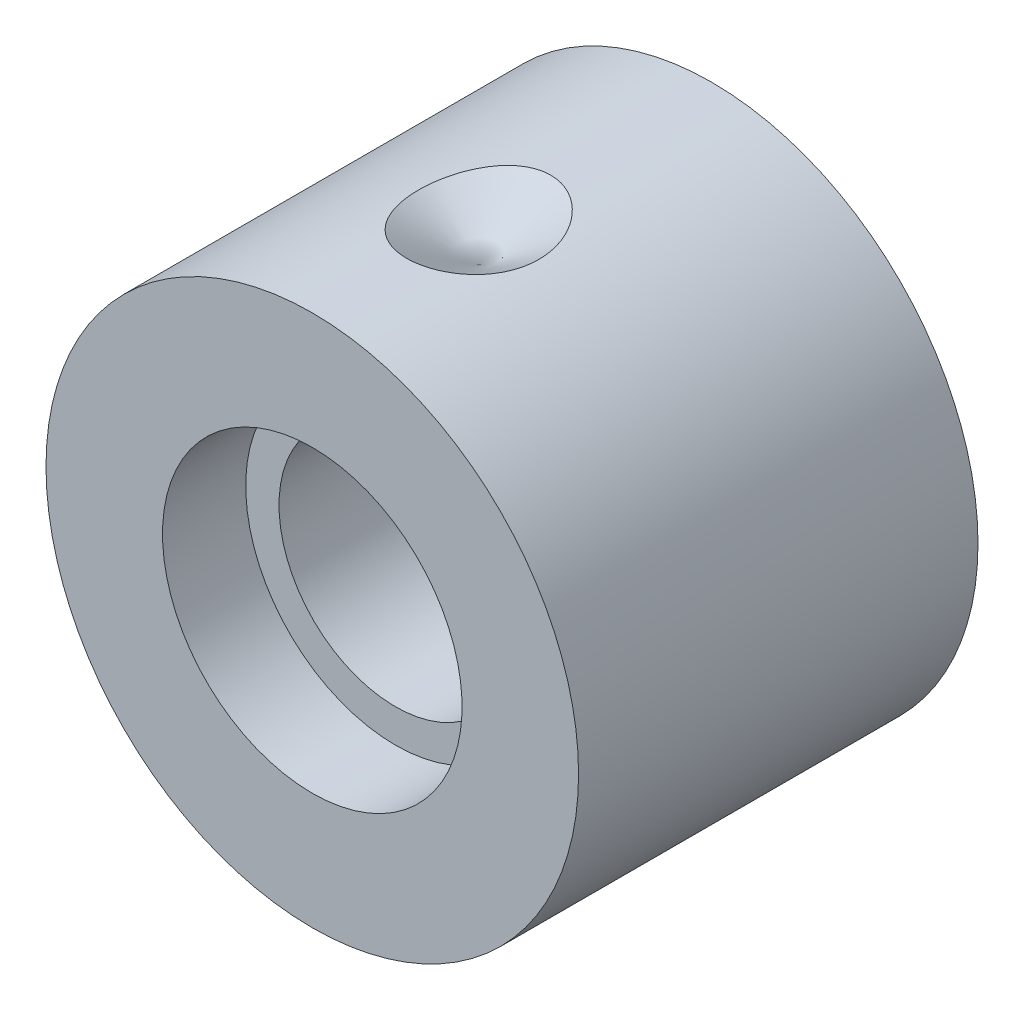
ISO-10303-21;
HEADER;
FILE_DESCRIPTION(('STEP AP214'),'2;1');
FILE_NAME('part.step','',(''),(''),'','','');
FILE_SCHEMA(('AUTOMOTIVE_DESIGN { 1 0 10303 214 1 1 1 1 }'));
ENDSEC;
DATA;
#1=APPLICATION_CONTEXT('core data for automotive mechanical design processes');
#2=APPLICATION_PROTOCOL_DEFINITION('international standard','automotive_design',2000,#1);
#3=PRODUCT_CONTEXT('',#1,'mechanical');
#4=PRODUCT('Part','Part','',(#3));
#5=PRODUCT_RELATED_PRODUCT_CATEGORY('part','',(#4));
#6=PRODUCT_DEFINITION_FORMATION('','',#4);
#7=PRODUCT_DEFINITION_CONTEXT('part definition',#1,'design');
#8=PRODUCT_DEFINITION('design','',#6,#7);
#9=PRODUCT_DEFINITION_SHAPE('','',#8);
#10=(LENGTH_UNIT() NAMED_UNIT(*) SI_UNIT(.MILLI.,.METRE.));
#11=(NAMED_UNIT(*) PLANE_ANGLE_UNIT() SI_UNIT($,.RADIAN.));
#12=(NAMED_UNIT(*) SI_UNIT($,.STERADIAN.) SOLID_ANGLE_UNIT());
#13=UNCERTAINTY_MEASURE_WITH_UNIT(LENGTH_MEASURE(1.E-05),#10,'distance_accuracy_value','');
#14=(GEOMETRIC_REPRESENTATION_CONTEXT(3) GLOBAL_UNCERTAINTY_ASSIGNED_CONTEXT((#13)) GLOBAL_UNIT_ASSIGNED_CONTEXT((#10,
#11,#12)) REPRESENTATION_CONTEXT('',''));
#15=CARTESIAN_POINT('',(0.,0.,0.));
#16=DIRECTION('',(0.,0.,1.));
#17=DIRECTION('',(1.,0.,0.));
#18=AXIS2_PLACEMENT_3D('',#15,#16,#17);
#19=CARTESIAN_POINT('',(0.,0.,-24.));
#20=DIRECTION('',(0.,0.,-1.));
#21=DIRECTION('',(0.,1.,0.));
#22=AXIS2_PLACEMENT_3D('',#19,#20,#21);
#23=CYLINDRICAL_SURFACE('',#22,16.);
#24=CARTESIAN_POINT('',(0.,0.,-24.));
#25=DIRECTION('',(0.,0.,-1.));
#26=DIRECTION('',(0.,1.,0.));
#27=AXIS2_PLACEMENT_3D('',#24,#25,#26);
#28=CIRCLE('',#27,16.);
#29=CARTESIAN_POINT('',(0.,16.,-24.));
#30=VERTEX_POINT('',#29);
#31=EDGE_CURVE('E85',#30,#30,#28,.T.);
#32=ORIENTED_EDGE('',*,*,#31,.F.);
#33=EDGE_LOOP('',(#32));
#34=FACE_BOUND('',#33,.T.);
#35=CARTESIAN_POINT('',(0.,0.,0.));
#36=DIRECTION('',(0.,0.,-1.));
#37=DIRECTION('',(0.,1.,0.));
#38=AXIS2_PLACEMENT_3D('',#35,#36,#37);
#39=CIRCLE('',#38,16.);
#40=CARTESIAN_POINT('',(0.,16.,0.));
#41=VERTEX_POINT('',#40);
#42=EDGE_CURVE('E82',#41,#41,#39,.T.);
#43=ORIENTED_EDGE('',*,*,#42,.T.);
#44=EDGE_LOOP('',(#43));
#45=FACE_BOUND('',#44,.T.);
#46=CARTESIAN_POINT('',(-3.10062299245772,15.6966919439924,-12.205108411998));
#47=CARTESIAN_POINT('',(-2.98979400932184,15.7185873832945,-12.4263712573796));
#48=CARTESIAN_POINT('',(-2.86118903065249,15.7427949874836,-12.6388049973656));
#49=CARTESIAN_POINT('',(-2.56928372447501,15.7930570809038,-13.0385031361824));
#50=CARTESIAN_POINT('',(-2.40596383213447,15.8191126060559,-13.2257532443046));
#51=CARTESIAN_POINT('',(-2.08516825631324,15.8641838823166,-13.5294122062539));
#52=CARTESIAN_POINT('',(-1.93397066438659,15.883509728823,-13.6523985189956));
#53=CARTESIAN_POINT('',(-1.61322245164739,15.9192797900866,-13.8720803733422));
#54=CARTESIAN_POINT('',(-1.44368906472925,15.9357266733616,-13.9688003076732));
#55=CARTESIAN_POINT('',(-1.088161452007,15.9639556724002,-14.1312241530824));
#56=CARTESIAN_POINT('',(-0.902046677985875,15.9756995207475,-14.1966744286684));
#57=CARTESIAN_POINT('',(-0.520387101643994,15.9926705117386,-14.2904207546169));
#58=CARTESIAN_POINT('',(-0.324850962165413,15.9979035265762,-14.3187502858232));
#59=CARTESIAN_POINT('',(0.0419169540594701,16.0008556940101,-14.3347686006014));
#60=CARTESIAN_POINT('',(0.212943363440281,15.9994769575835,-14.3273362508705));
#61=CARTESIAN_POINT('',(0.5510340430608,15.9914020320376,-14.2832942598649));
#62=CARTESIAN_POINT('',(0.718098616474647,15.9847062511588,-14.2466868586391));
#63=CARTESIAN_POINT('',(1.03851224766184,15.9670439347494,-14.1481826570075));
#64=CARTESIAN_POINT('',(1.19212673090042,15.9562173484747,-14.08711160172));
#65=CARTESIAN_POINT('',(1.48823446757911,15.9313298113025,-13.9428333279681));
#66=CARTESIAN_POINT('',(1.63072465713257,15.9172679735219,-13.8596200386476));
#67=CARTESIAN_POINT('',(1.91779457157597,15.885377364279,-13.6639793545985));
#68=CARTESIAN_POINT('',(2.06082246812204,15.8673031198553,-13.5493243540887));
#69=CARTESIAN_POINT('',(2.32908764842704,15.8301524437662,-13.3010008597102));
#70=CARTESIAN_POINT('',(2.45431456370299,15.8110754368132,-13.1673213746792));
#71=CARTESIAN_POINT('',(2.70687692967852,15.7699719298713,-12.8593784244792));
#72=CARTESIAN_POINT('',(2.83058924378875,15.7480276430944,-12.6821316456941));
#73=CARTESIAN_POINT('',(3.05142407284082,15.7067322408783,-12.3115219551044));
#74=CARTESIAN_POINT('',(3.14853007664362,15.6873827394761,-12.1181491325623));
#75=CARTESIAN_POINT('',(3.329121325245,15.6501385559612,-11.6875661151684));
#76=CARTESIAN_POINT('',(3.40790095619091,15.632978902651,-11.4483087100507));
#77=CARTESIAN_POINT('',(3.52835697099908,15.6062324504661,-10.9602312393155));
#78=CARTESIAN_POINT('',(3.57002057240343,15.5966482606472,-10.7114079100229));
#79=CARTESIAN_POINT('',(3.61775455512292,15.5856528732117,-10.1892810865471));
#80=CARTESIAN_POINT('',(3.62058441300583,15.5849858907507,-9.91565959200532));
#81=CARTESIAN_POINT('',(3.58219599962153,15.5938523551184,-9.37158404855133));
#82=CARTESIAN_POINT('',(3.54095844422974,15.6033902676634,-9.10113143873828));
#83=CARTESIAN_POINT('',(3.41386825737424,15.6316923561088,-8.56687815645871));
#84=CARTESIAN_POINT('',(3.32732691704505,15.6505987071039,-8.30324803019358));
#85=CARTESIAN_POINT('',(3.10996686270031,15.6952343307027,-7.79546458935414));
#86=CARTESIAN_POINT('',(2.97917163388267,15.7209599827908,-7.55130102877113));
#87=CARTESIAN_POINT('',(2.70393720638124,15.7703595222064,-7.13637005039314));
#88=CARTESIAN_POINT('',(2.56701396368525,15.7934698332427,-6.9605355029559));
#89=CARTESIAN_POINT('',(2.26608135629307,15.8394432447751,-6.63377634592041));
#90=CARTESIAN_POINT('',(2.10210709214514,15.8623066252472,-6.48281995607704));
#91=CARTESIAN_POINT('',(1.77907191343034,15.9014678023246,-6.23580296996667));
#92=CARTESIAN_POINT('',(1.62387195664474,15.9182219959961,-6.13477583738728));
#93=CARTESIAN_POINT('',(1.29861807491348,15.9480462526524,-5.95948244686598));
#94=CARTESIAN_POINT('',(1.12857208930819,15.9611182691696,-5.88520199296981));
#95=CARTESIAN_POINT('',(0.776489571822869,15.9821242160927,-5.76748227138121));
#96=CARTESIAN_POINT('',(0.594384561198971,15.9900254259321,-5.72423924338052));
#97=CARTESIAN_POINT('',(0.225140726455454,15.9994787658006,-5.6726314072914));
#98=CARTESIAN_POINT('',(0.0380048596149942,16.001034547116,-5.66424654106787));
#99=CARTESIAN_POINT('',(-0.314185329627457,15.9977795926755,-5.68193653126315));
#100=CARTESIAN_POINT('',(-0.479441198530106,15.9936384609731,-5.70438663543885));
#101=CARTESIAN_POINT('',(-0.80380977101556,15.9806209824522,-5.7760454188668));
#102=CARTESIAN_POINT('',(-0.962922020458883,15.9717442862943,-5.82525607223225));
#103=CARTESIAN_POINT('',(-1.27293450175804,15.9500499855358,-5.94837620851503));
#104=CARTESIAN_POINT('',(-1.42372497124972,15.937190048244,-6.0225517820597));
#105=CARTESIAN_POINT('',(-1.71258174356145,15.9087450176498,-6.19202336126931));
#106=CARTESIAN_POINT('',(-1.85064342152139,15.8931589397481,-6.28732700108939));
#107=CARTESIAN_POINT('',(-2.13039372950921,15.8582453724105,-6.50993873476661));
#108=CARTESIAN_POINT('',(-2.26998255767046,15.8386979288034,-6.6398436145019));
#109=CARTESIAN_POINT('',(-2.52936010046986,15.7993536876726,-6.91803883757017));
#110=CARTESIAN_POINT('',(-2.64913624903627,15.7795567404027,-7.06634074556868));
#111=CARTESIAN_POINT('',(-2.88818775430554,15.7377157608671,-7.40587059803417));
#112=CARTESIAN_POINT('',(-3.00339583607329,15.7159194879193,-7.59999655166047));
#113=CARTESIAN_POINT('',(-3.2045491506064,15.6761403208908,-8.00318787511691));
#114=CARTESIAN_POINT('',(-3.29048041290867,15.6581592489067,-8.21226031978209));
#115=CARTESIAN_POINT('',(-3.44284200340305,15.6254226941183,-8.67155430347308));
#116=CARTESIAN_POINT('',(-3.5046851170183,15.6115040216607,-8.92336718745427));
#117=CARTESIAN_POINT('',(-3.58890658413202,15.5923572261077,-9.43398098625556));
#118=CARTESIAN_POINT('',(-3.61125190388958,15.5871363775943,-9.6927875667431));
#119=CARTESIAN_POINT('',(-3.61633872125717,15.5859600286308,-10.2272020324835));
#120=CARTESIAN_POINT('',(-3.59648686118349,15.5906112190125,-10.5028375955532));
#121=CARTESIAN_POINT('',(-3.51205420004791,15.6098478157157,-11.0464244478744));
#122=CARTESIAN_POINT('',(-3.44756557292487,15.6244127493479,-11.3143903894544));
#123=CARTESIAN_POINT('',(-3.32532522629241,15.6506704051637,-11.682622957175));
#124=CARTESIAN_POINT('',(-3.28565636291694,15.6590683037606,-11.7893859046543));
#125=CARTESIAN_POINT('',(-3.19878770763232,15.6770448109401,-11.9997585794094));
#126=CARTESIAN_POINT('',(-3.15158459499745,15.6866239397252,-12.1033668921888));
#127=CARTESIAN_POINT('',(-3.10062299245772,15.6966919439924,-12.205108411998));
#128=B_SPLINE_CURVE_WITH_KNOTS('',3,(#46,#47,#48,#49,#50,#51,#52,#53,#54,#55,#56,#57,#58,#59,
#60,#61,#62,#63,#64,#65,#66,#67,#68,#69,#70,#71,#72,#73,#74,#75,#76,#77,#78,#79,#80,#81,#82,#83,
#84,#85,#86,#87,#88,#89,#90,#91,#92,#93,#94,#95,#96,#97,#98,#99,#100,#101,#102,#103,#104,#105,
#106,#107,#108,#109,#110,#111,#112,#113,#114,#115,#116,#117,#118,#119,#120,#121,#122,#123,#124,
#125,#126,#127),.UNSPECIFIED.,.T.,.F.,(4,2,2,2,2,2,2,2,2,2,2,2,2,2,2,2,2,2,2,2,2,2,2,2,2,2,2,2,
2,2,2,2,2,2,2,2,2,2,2,2,4),(0.,0.74489792939129,1.49021679109949,2.07546428621063,
2.66016640798962,3.24953388635521,3.83836942134562,4.34933832978728,4.86026801001833,
5.35523665930446,5.85034115690858,6.40087177968124,6.95172176579965,7.60102122897376,
8.25072272145368,9.00496226783436,9.75946146785879,10.5765710666563,11.3940383832601,
12.2243100625534,13.0541418123722,13.7236779075763,14.3923519703115,14.9479136693267,
15.5031800646045,16.0619270237763,16.6203524234052,17.1184524300008,17.6165891861868,
18.120212998046,18.6240190805822,19.1969263053579,19.7701955112774,20.447912302048,
21.1259520377281,21.9015867292527,22.6778698117735,23.5032349076928,24.3269007078793,
24.6692698309047,25.0117902721847),.UNSPECIFIED.);
#129=CARTESIAN_POINT('',(-3.10062299245772,15.6966919439924,-12.205108411998));
#130=VERTEX_POINT('',#129);
#131=EDGE_CURVE('E34',#130,#130,#128,.T.);
#132=ORIENTED_EDGE('',*,*,#131,.T.);
#133=EDGE_LOOP('',(#132));
#134=FACE_BOUND('',#133,.T.);
#135=ADVANCED_FACE('F30',(#34,#45,#134),#23,.T.);
#136=CARTESIAN_POINT('',(0.,0.,-5.));
#137=DIRECTION('',(0.,0.,1.));
#138=DIRECTION('',(0.,-1.,0.));
#139=AXIS2_PLACEMENT_3D('',#136,#137,#138);
#140=PLANE('',#139);
#141=CARTESIAN_POINT('',(0.,0.,-5.));
#142=DIRECTION('',(0.,0.,1.));
#143=DIRECTION('',(1.,0.,0.));
#144=AXIS2_PLACEMENT_3D('',#141,#142,#143);
#145=CIRCLE('',#144,6.99999999999999);
#146=CARTESIAN_POINT('',(6.99999999999999,0.,-5.));
#147=VERTEX_POINT('',#146);
#148=EDGE_CURVE('E93',#147,#147,#145,.T.);
#149=ORIENTED_EDGE('',*,*,#148,.F.);
#150=EDGE_LOOP('',(#149));
#151=FACE_BOUND('',#150,.T.);
#152=CARTESIAN_POINT('',(0.,0.,-5.));
#153=DIRECTION('',(0.,0.,-1.));
#154=DIRECTION('',(0.,1.,0.));
#155=AXIS2_PLACEMENT_3D('',#152,#153,#154);
#156=CIRCLE('',#155,9.);
#157=CARTESIAN_POINT('',(0.,8.99999999999999,-5.));
#158=VERTEX_POINT('',#157);
#159=EDGE_CURVE('E11',#158,#158,#156,.T.);
#160=ORIENTED_EDGE('',*,*,#159,.F.);
#161=EDGE_LOOP('',(#160));
#162=FACE_BOUND('',#161,.T.);
#163=ADVANCED_FACE('F32',(#151,#162),#140,.T.);
#164=CARTESIAN_POINT('',(0.,0.,-24.));
#165=DIRECTION('',(0.,0.,-1.));
#166=DIRECTION('',(0.,1.,0.));
#167=AXIS2_PLACEMENT_3D('',#164,#165,#166);
#168=CYLINDRICAL_SURFACE('',#167,9.);
#169=ORIENTED_EDGE('',*,*,#159,.T.);
#170=EDGE_LOOP('',(#169));
#171=FACE_BOUND('',#170,.T.);
#172=CARTESIAN_POINT('',(0.,0.,0.));
#173=DIRECTION('',(0.,0.,-1.));
#174=DIRECTION('',(0.,1.,0.));
#175=AXIS2_PLACEMENT_3D('',#172,#173,#174);
#176=CIRCLE('',#175,9.);
#177=CARTESIAN_POINT('',(0.,8.99999999999999,0.));
#178=VERTEX_POINT('',#177);
#179=EDGE_CURVE('E42',#178,#178,#176,.T.);
#180=ORIENTED_EDGE('',*,*,#179,.F.);
#181=EDGE_LOOP('',(#180));
#182=FACE_BOUND('',#181,.T.);
#183=ADVANCED_FACE('F66',(#171,#182),#168,.F.);
#184=CARTESIAN_POINT('',(0.,8.99999999999999,0.));
#185=DIRECTION('',(0.,0.,1.));
#186=DIRECTION('',(0.,-1.,0.));
#187=AXIS2_PLACEMENT_3D('',#184,#185,#186);
#188=PLANE('',#187);
#189=ORIENTED_EDGE('',*,*,#179,.T.);
#190=EDGE_LOOP('',(#189));
#191=FACE_BOUND('',#190,.T.);
#192=ORIENTED_EDGE('',*,*,#42,.F.);
#193=EDGE_LOOP('',(#192));
#194=FACE_BOUND('',#193,.T.);
#195=ADVANCED_FACE('F56',(#191,#194),#188,.T.);
#196=CARTESIAN_POINT('',(0.,16.,-24.));
#197=DIRECTION('',(0.,0.,-1.));
#198=DIRECTION('',(0.,1.,0.));
#199=AXIS2_PLACEMENT_3D('',#196,#197,#198);
#200=PLANE('',#199);
#201=CARTESIAN_POINT('',(0.,0.,-24.));
#202=DIRECTION('',(0.,0.,-1.));
#203=DIRECTION('',(0.,1.,0.));
#204=AXIS2_PLACEMENT_3D('',#201,#202,#203);
#205=CIRCLE('',#204,6.99999999999999);
#206=CARTESIAN_POINT('',(0.,6.99999999999999,-24.));
#207=VERTEX_POINT('',#206);
#208=EDGE_CURVE('E90',#207,#207,#205,.T.);
#209=ORIENTED_EDGE('',*,*,#208,.F.);
#210=EDGE_LOOP('',(#209));
#211=FACE_BOUND('',#210,.T.);
#212=ORIENTED_EDGE('',*,*,#31,.T.);
#213=EDGE_LOOP('',(#212));
#214=FACE_BOUND('',#213,.T.);
#215=ADVANCED_FACE('F48',(#211,#214),#200,.T.);
#216=CARTESIAN_POINT('',(0.,17.1267370293003,-10.));
#217=DIRECTION('',(0.,1.,0.));
#218=DIRECTION('',(0.,0.,1.));
#219=AXIS2_PLACEMENT_3D('',#216,#217,#218);
#220=CONICAL_SURFACE('',#219,6.28169280043943,1.04719755119659);
#221=ORIENTED_EDGE('',*,*,#131,.F.);
#222=EDGE_LOOP('',(#221));
#223=FACE_BOUND('',#222,.T.);
#224=CARTESIAN_POINT('',(0.,13.5,-10.));
#225=VERTEX_POINT('',#224);
#226=VERTEX_LOOP('',#225);
#227=FACE_BOUND('',#226,.T.);
#228=ADVANCED_FACE('F45',(#223,#227),#220,.F.);
#229=CARTESIAN_POINT('',(0.,0.,-5.));
#230=DIRECTION('',(0.,0.,1.));
#231=DIRECTION('',(1.,0.,0.));
#232=AXIS2_PLACEMENT_3D('',#229,#230,#231);
#233=CYLINDRICAL_SURFACE('',#232,6.99999999999999);
#234=ORIENTED_EDGE('',*,*,#148,.T.);
#235=EDGE_LOOP('',(#234));
#236=FACE_BOUND('',#235,.T.);
#237=ORIENTED_EDGE('',*,*,#208,.T.);
#238=EDGE_LOOP('',(#237));
#239=FACE_BOUND('',#238,.T.);
#240=ADVANCED_FACE('F47',(#236,#239),#233,.F.);
#241=CLOSED_SHELL('',(#135,#163,#183,#195,#215,#228,#240));
#242=MANIFOLD_SOLID_BREP('B2',#241);
#243=ADVANCED_BREP_SHAPE_REPRESENTATION('',(#18,#242),#14);
#244=SHAPE_DEFINITION_REPRESENTATION(#9,#243);
ENDSEC;
END-ISO-10303-21;
